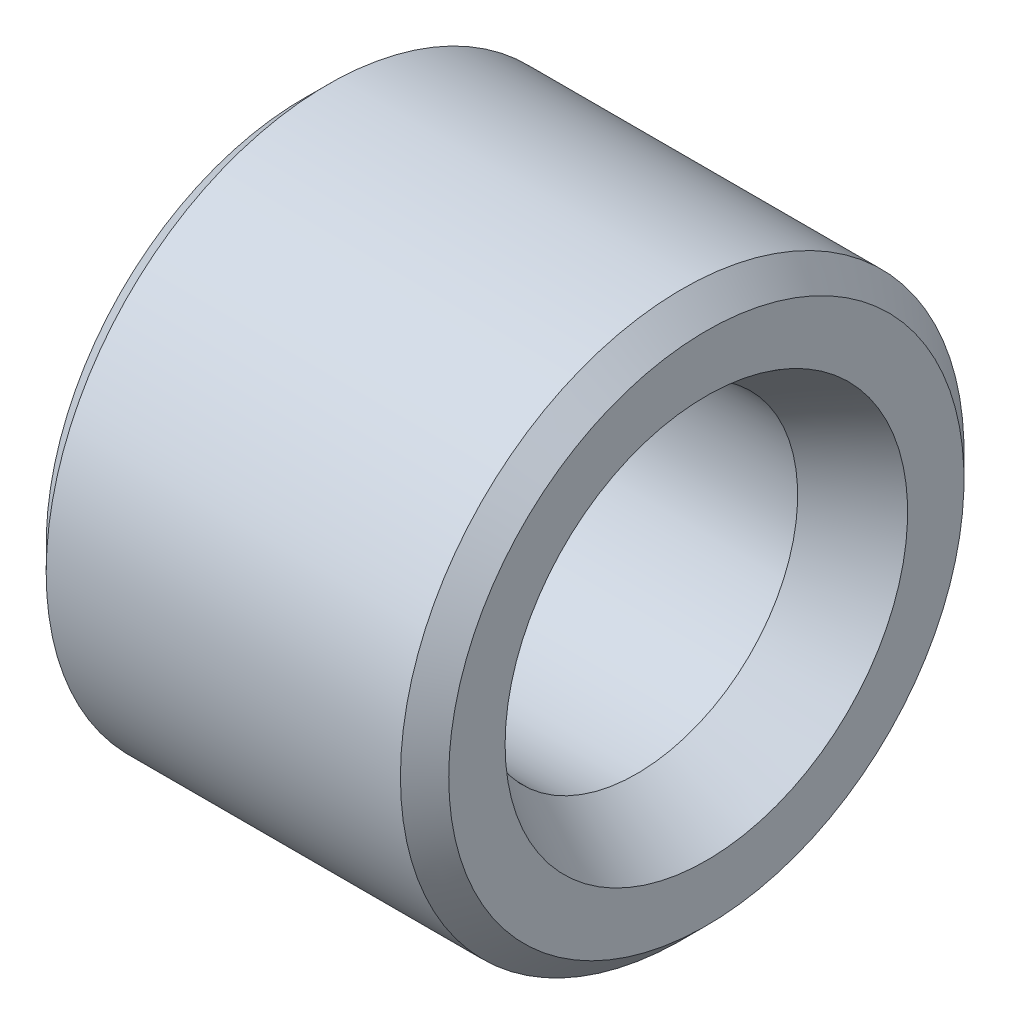
ISO-10303-21;
HEADER;
FILE_DESCRIPTION(('STEP AP214'),'2;1');
FILE_NAME('part.step','',(''),(''),'','','');
FILE_SCHEMA(('AUTOMOTIVE_DESIGN { 1 0 10303 214 1 1 1 1 }'));
ENDSEC;
DATA;
#1=APPLICATION_CONTEXT('core data for automotive mechanical design processes');
#2=APPLICATION_PROTOCOL_DEFINITION('international standard','automotive_design',2000,#1);
#3=PRODUCT_CONTEXT('',#1,'mechanical');
#4=PRODUCT('Part','Part','',(#3));
#5=PRODUCT_RELATED_PRODUCT_CATEGORY('part','',(#4));
#6=PRODUCT_DEFINITION_FORMATION('','',#4);
#7=PRODUCT_DEFINITION_CONTEXT('part definition',#1,'design');
#8=PRODUCT_DEFINITION('design','',#6,#7);
#9=PRODUCT_DEFINITION_SHAPE('','',#8);
#10=(LENGTH_UNIT() NAMED_UNIT(*) SI_UNIT(.MILLI.,.METRE.));
#11=(NAMED_UNIT(*) PLANE_ANGLE_UNIT() SI_UNIT($,.RADIAN.));
#12=(NAMED_UNIT(*) SI_UNIT($,.STERADIAN.) SOLID_ANGLE_UNIT());
#13=UNCERTAINTY_MEASURE_WITH_UNIT(LENGTH_MEASURE(1.E-05),#10,'distance_accuracy_value','');
#14=(GEOMETRIC_REPRESENTATION_CONTEXT(3) GLOBAL_UNCERTAINTY_ASSIGNED_CONTEXT((#13)) GLOBAL_UNIT_ASSIGNED_CONTEXT((#10,
#11,#12)) REPRESENTATION_CONTEXT('',''));
#15=CARTESIAN_POINT('',(0.,0.,0.));
#16=DIRECTION('',(0.,0.,1.));
#17=DIRECTION('',(1.,0.,0.));
#18=AXIS2_PLACEMENT_3D('',#15,#16,#17);
#19=CARTESIAN_POINT('',(0.,0.,0.));
#20=DIRECTION('',(-1.,0.,0.));
#21=DIRECTION('',(0.,0.,1.));
#22=AXIS2_PLACEMENT_3D('',#19,#20,#21);
#23=CYLINDRICAL_SURFACE('',#22,2.);
#24=CARTESIAN_POINT('',(0.866025403784451,0.,0.));
#25=DIRECTION('',(-1.,0.,0.));
#26=DIRECTION('',(0.,0.,1.));
#27=AXIS2_PLACEMENT_3D('',#24,#25,#26);
#28=CIRCLE('',#27,2.);
#29=CARTESIAN_POINT('',(0.866025403784451,0.,2.));
#30=VERTEX_POINT('',#29);
#31=EDGE_CURVE('E72',#30,#30,#28,.T.);
#32=ORIENTED_EDGE('',*,*,#31,.T.);
#33=EDGE_LOOP('',(#32));
#34=FACE_BOUND('',#33,.T.);
#35=CARTESIAN_POINT('',(4.13397459621555,0.,0.));
#36=DIRECTION('',(-1.,0.,0.));
#37=DIRECTION('',(0.,0.,1.));
#38=AXIS2_PLACEMENT_3D('',#35,#36,#37);
#39=CIRCLE('',#38,2.);
#40=CARTESIAN_POINT('',(4.13397459621555,0.,2.));
#41=VERTEX_POINT('',#40);
#42=EDGE_CURVE('E80',#41,#41,#39,.T.);
#43=ORIENTED_EDGE('',*,*,#42,.F.);
#44=EDGE_LOOP('',(#43));
#45=FACE_BOUND('',#44,.T.);
#46=ADVANCED_FACE('F42',(#34,#45),#23,.F.);
#47=CARTESIAN_POINT('',(5.,3.5,0.));
#48=DIRECTION('',(-1.,0.,0.));
#49=DIRECTION('',(0.,0.,1.));
#50=AXIS2_PLACEMENT_3D('',#47,#48,#49);
#51=PLANE('',#50);
#52=CARTESIAN_POINT('',(5.,0.,0.));
#53=DIRECTION('',(-1.,0.,0.));
#54=DIRECTION('',(0.,0.,1.));
#55=AXIS2_PLACEMENT_3D('',#52,#53,#54);
#56=CIRCLE('',#55,3.2);
#57=CARTESIAN_POINT('',(5.,0.,3.2));
#58=VERTEX_POINT('',#57);
#59=EDGE_CURVE('E50',#58,#58,#56,.F.);
#60=ORIENTED_EDGE('',*,*,#59,.T.);
#61=EDGE_LOOP('',(#60));
#62=FACE_BOUND('',#61,.T.);
#63=CARTESIAN_POINT('',(5.,0.,0.));
#64=DIRECTION('',(-1.,0.,0.));
#65=DIRECTION('',(0.,0.,1.));
#66=AXIS2_PLACEMENT_3D('',#63,#64,#65);
#67=CIRCLE('',#66,2.5);
#68=CARTESIAN_POINT('',(5.,0.,2.5));
#69=VERTEX_POINT('',#68);
#70=EDGE_CURVE('E76',#69,#69,#67,.T.);
#71=ORIENTED_EDGE('',*,*,#70,.T.);
#72=EDGE_LOOP('',(#71));
#73=FACE_BOUND('',#72,.T.);
#74=ADVANCED_FACE('F90',(#62,#73),#51,.F.);
#75=CARTESIAN_POINT('',(0.,2.,0.));
#76=DIRECTION('',(1.,0.,0.));
#77=DIRECTION('',(0.,0.,-1.));
#78=AXIS2_PLACEMENT_3D('',#75,#76,#77);
#79=PLANE('',#78);
#80=CARTESIAN_POINT('',(0.,0.,0.));
#81=DIRECTION('',(1.,0.,0.));
#82=DIRECTION('',(0.,0.,-1.));
#83=AXIS2_PLACEMENT_3D('',#80,#81,#82);
#84=CIRCLE('',#83,3.2);
#85=CARTESIAN_POINT('',(0.,0.,-3.2));
#86=VERTEX_POINT('',#85);
#87=EDGE_CURVE('E10',#86,#86,#84,.F.);
#88=ORIENTED_EDGE('',*,*,#87,.T.);
#89=EDGE_LOOP('',(#88));
#90=FACE_BOUND('',#89,.T.);
#91=CARTESIAN_POINT('',(0.,0.,0.));
#92=DIRECTION('',(-1.,0.,0.));
#93=DIRECTION('',(0.,0.,1.));
#94=AXIS2_PLACEMENT_3D('',#91,#92,#93);
#95=CIRCLE('',#94,2.5);
#96=CARTESIAN_POINT('',(0.,0.,2.5));
#97=VERTEX_POINT('',#96);
#98=EDGE_CURVE('E68',#97,#97,#95,.T.);
#99=ORIENTED_EDGE('',*,*,#98,.F.);
#100=EDGE_LOOP('',(#99));
#101=FACE_BOUND('',#100,.T.);
#102=ADVANCED_FACE('F96',(#90,#101),#79,.F.);
#103=CARTESIAN_POINT('',(0.,0.,0.));
#104=DIRECTION('',(-1.,0.,0.));
#105=DIRECTION('',(0.,0.,1.));
#106=AXIS2_PLACEMENT_3D('',#103,#104,#105);
#107=CYLINDRICAL_SURFACE('',#106,3.5);
#108=CARTESIAN_POINT('',(4.7,0.,0.));
#109=DIRECTION('',(-1.,0.,0.));
#110=DIRECTION('',(0.,0.,1.));
#111=AXIS2_PLACEMENT_3D('',#108,#109,#110);
#112=CIRCLE('',#111,3.5);
#113=CARTESIAN_POINT('',(4.7,0.,3.5));
#114=VERTEX_POINT('',#113);
#115=EDGE_CURVE('E56',#114,#114,#112,.T.);
#116=CARTESIAN_POINT('',(0.300000000000001,0.,0.));
#117=DIRECTION('',(1.,0.,0.));
#118=DIRECTION('',(0.,0.,-1.));
#119=AXIS2_PLACEMENT_3D('',#116,#117,#118);
#120=CIRCLE('',#119,3.5);
#121=CARTESIAN_POINT('',(0.300000000000001,0.,3.5));
#122=VERTEX_POINT('',#121);
#123=EDGE_CURVE('E62',#122,#122,#120,.T.);
#124=CARTESIAN_POINT('',(4.7,0.,3.5));
#125=CARTESIAN_POINT('',(4.65416666666667,0.,3.5));
#126=CARTESIAN_POINT('',(4.60833333333334,0.,3.5));
#127=CARTESIAN_POINT('',(4.51666666666667,0.,3.5));
#128=CARTESIAN_POINT('',(4.47083333333333,0.,3.5));
#129=CARTESIAN_POINT('',(4.37916666666667,0.,3.5));
#130=CARTESIAN_POINT('',(4.33333333333333,0.,3.5));
#131=CARTESIAN_POINT('',(4.24166666666667,0.,3.5));
#132=CARTESIAN_POINT('',(4.19583333333333,0.,3.5));
#133=CARTESIAN_POINT('',(4.10416666666667,0.,3.5));
#134=CARTESIAN_POINT('',(4.05833333333333,0.,3.5));
#135=CARTESIAN_POINT('',(3.96666666666667,0.,3.5));
#136=CARTESIAN_POINT('',(3.92083333333333,0.,3.5));
#137=CARTESIAN_POINT('',(3.82916666666667,0.,3.5));
#138=CARTESIAN_POINT('',(3.78333333333333,0.,3.5));
#139=CARTESIAN_POINT('',(3.69166666666667,0.,3.5));
#140=CARTESIAN_POINT('',(3.64583333333333,0.,3.5));
#141=CARTESIAN_POINT('',(3.55416666666667,0.,3.5));
#142=CARTESIAN_POINT('',(3.50833333333333,0.,3.5));
#143=CARTESIAN_POINT('',(3.41666666666667,0.,3.5));
#144=CARTESIAN_POINT('',(3.37083333333333,0.,3.5));
#145=CARTESIAN_POINT('',(3.27916666666667,0.,3.5));
#146=CARTESIAN_POINT('',(3.23333333333333,0.,3.5));
#147=CARTESIAN_POINT('',(3.14166666666667,0.,3.5));
#148=CARTESIAN_POINT('',(3.09583333333333,0.,3.5));
#149=CARTESIAN_POINT('',(3.00416666666667,0.,3.5));
#150=CARTESIAN_POINT('',(2.95833333333333,0.,3.5));
#151=CARTESIAN_POINT('',(2.86666666666667,0.,3.5));
#152=CARTESIAN_POINT('',(2.82083333333333,0.,3.5));
#153=CARTESIAN_POINT('',(2.72916666666667,0.,3.5));
#154=CARTESIAN_POINT('',(2.68333333333333,0.,3.5));
#155=CARTESIAN_POINT('',(2.59166666666667,0.,3.5));
#156=CARTESIAN_POINT('',(2.54583333333333,0.,3.5));
#157=CARTESIAN_POINT('',(2.45416666666667,0.,3.5));
#158=CARTESIAN_POINT('',(2.40833333333333,0.,3.5));
#159=CARTESIAN_POINT('',(2.31666666666667,0.,3.5));
#160=CARTESIAN_POINT('',(2.27083333333333,0.,3.5));
#161=CARTESIAN_POINT('',(2.17916666666667,0.,3.5));
#162=CARTESIAN_POINT('',(2.13333333333333,0.,3.5));
#163=CARTESIAN_POINT('',(2.04166666666667,0.,3.5));
#164=CARTESIAN_POINT('',(1.99583333333333,0.,3.5));
#165=CARTESIAN_POINT('',(1.90416666666667,0.,3.5));
#166=CARTESIAN_POINT('',(1.85833333333333,0.,3.5));
#167=CARTESIAN_POINT('',(1.76666666666667,0.,3.5));
#168=CARTESIAN_POINT('',(1.72083333333333,0.,3.5));
#169=CARTESIAN_POINT('',(1.62916666666667,0.,3.5));
#170=CARTESIAN_POINT('',(1.58333333333333,0.,3.5));
#171=CARTESIAN_POINT('',(1.49166666666667,0.,3.5));
#172=CARTESIAN_POINT('',(1.44583333333333,0.,3.5));
#173=CARTESIAN_POINT('',(1.35416666666667,0.,3.5));
#174=CARTESIAN_POINT('',(1.30833333333333,0.,3.5));
#175=CARTESIAN_POINT('',(1.21666666666667,0.,3.5));
#176=CARTESIAN_POINT('',(1.17083333333333,0.,3.5));
#177=CARTESIAN_POINT('',(1.07916666666667,0.,3.5));
#178=CARTESIAN_POINT('',(1.03333333333333,0.,3.5));
#179=CARTESIAN_POINT('',(0.941666666666668,0.,3.5));
#180=CARTESIAN_POINT('',(0.895833333333334,0.,3.5));
#181=CARTESIAN_POINT('',(0.804166666666667,0.,3.5));
#182=CARTESIAN_POINT('',(0.758333333333334,0.,3.5));
#183=CARTESIAN_POINT('',(0.666666666666667,0.,3.5));
#184=CARTESIAN_POINT('',(0.620833333333334,0.,3.5));
#185=CARTESIAN_POINT('',(0.529166666666667,0.,3.5));
#186=CARTESIAN_POINT('',(0.483333333333334,0.,3.5));
#187=CARTESIAN_POINT('',(0.391666666666667,0.,3.5));
#188=CARTESIAN_POINT('',(0.345833333333334,0.,3.5));
#189=CARTESIAN_POINT('',(0.300000000000001,0.,3.5));
#190=B_SPLINE_CURVE_WITH_KNOTS('',3,(#124,#125,#126,#127,#128,#129,#130,#131,#132,#133,#134,
#135,#136,#137,#138,#139,#140,#141,#142,#143,#144,#145,#146,#147,#148,#149,#150,#151,#152,#153,
#154,#155,#156,#157,#158,#159,#160,#161,#162,#163,#164,#165,#166,#167,#168,#169,#170,#171,#172,
#173,#174,#175,#176,#177,#178,#179,#180,#181,#182,#183,#184,#185,#186,#187,#188,#189),
.UNSPECIFIED.,.F.,.F.,(4,2,2,2,2,2,2,2,2,2,2,2,2,2,2,2,2,2,2,2,2,2,2,2,2,2,2,2,2,2,2,2,4),(0.,
0.1375,0.275,0.4125,0.55,0.6875,0.825,0.9625,1.1,1.2375,1.375,1.5125,1.65,1.7875,1.925,2.0625,
2.2,2.3375,2.475,2.6125,2.75,2.8875,3.025,3.1625,3.3,3.4375,3.575,3.7125,3.85,3.9875,4.125,
4.2625,4.4),.UNSPECIFIED.);
#191=EDGE_CURVE('BSEAM102',#114,#122,#190,.T.);
#192=ORIENTED_EDGE('',*,*,#115,.T.);
#193=ORIENTED_EDGE('',*,*,#123,.T.);
#194=ORIENTED_EDGE('',*,*,#191,.T.);
#195=ORIENTED_EDGE('',*,*,#191,.F.);
#196=EDGE_LOOP('',(#192,#194,#193,#195));
#197=FACE_BOUND('',#196,.T.);
#198=ADVANCED_FACE('F102',(#197),#107,.T.);
#199=CARTESIAN_POINT('',(4.7,0.,0.));
#200=DIRECTION('',(-1.,0.,0.));
#201=DIRECTION('',(0.,0.,1.));
#202=AXIS2_PLACEMENT_3D('',#199,#200,#201);
#203=CONICAL_SURFACE('',#202,3.5,0.785398163397448);
#204=CARTESIAN_POINT('',(5.,0.,3.2));
#205=CARTESIAN_POINT('',(4.996875,0.,3.203125));
#206=CARTESIAN_POINT('',(4.99375,0.,3.20625));
#207=CARTESIAN_POINT('',(4.9875,0.,3.2125));
#208=CARTESIAN_POINT('',(4.984375,0.,3.215625));
#209=CARTESIAN_POINT('',(4.978125,0.,3.221875));
#210=CARTESIAN_POINT('',(4.975,0.,3.225));
#211=CARTESIAN_POINT('',(4.96875,0.,3.23125));
#212=CARTESIAN_POINT('',(4.965625,0.,3.234375));
#213=CARTESIAN_POINT('',(4.959375,0.,3.240625));
#214=CARTESIAN_POINT('',(4.95625,0.,3.24375));
#215=CARTESIAN_POINT('',(4.95,0.,3.25));
#216=CARTESIAN_POINT('',(4.946875,0.,3.253125));
#217=CARTESIAN_POINT('',(4.940625,0.,3.259375));
#218=CARTESIAN_POINT('',(4.9375,0.,3.2625));
#219=CARTESIAN_POINT('',(4.93125,0.,3.26875));
#220=CARTESIAN_POINT('',(4.928125,0.,3.271875));
#221=CARTESIAN_POINT('',(4.921875,0.,3.278125));
#222=CARTESIAN_POINT('',(4.91875,0.,3.28125));
#223=CARTESIAN_POINT('',(4.9125,0.,3.2875));
#224=CARTESIAN_POINT('',(4.909375,0.,3.290625));
#225=CARTESIAN_POINT('',(4.903125,0.,3.296875));
#226=CARTESIAN_POINT('',(4.9,0.,3.3));
#227=CARTESIAN_POINT('',(4.89375,0.,3.30625));
#228=CARTESIAN_POINT('',(4.890625,0.,3.309375));
#229=CARTESIAN_POINT('',(4.884375,0.,3.315625));
#230=CARTESIAN_POINT('',(4.88125,0.,3.31875));
#231=CARTESIAN_POINT('',(4.875,0.,3.325));
#232=CARTESIAN_POINT('',(4.871875,0.,3.328125));
#233=CARTESIAN_POINT('',(4.865625,0.,3.334375));
#234=CARTESIAN_POINT('',(4.8625,0.,3.3375));
#235=CARTESIAN_POINT('',(4.85625,0.,3.34375));
#236=CARTESIAN_POINT('',(4.853125,0.,3.346875));
#237=CARTESIAN_POINT('',(4.846875,0.,3.353125));
#238=CARTESIAN_POINT('',(4.84375,0.,3.35625));
#239=CARTESIAN_POINT('',(4.8375,0.,3.3625));
#240=CARTESIAN_POINT('',(4.834375,0.,3.365625));
#241=CARTESIAN_POINT('',(4.828125,0.,3.371875));
#242=CARTESIAN_POINT('',(4.825,0.,3.375));
#243=CARTESIAN_POINT('',(4.81875,0.,3.38125));
#244=CARTESIAN_POINT('',(4.815625,0.,3.384375));
#245=CARTESIAN_POINT('',(4.809375,0.,3.390625));
#246=CARTESIAN_POINT('',(4.80625,0.,3.39375));
#247=CARTESIAN_POINT('',(4.8,0.,3.4));
#248=CARTESIAN_POINT('',(4.796875,0.,3.403125));
#249=CARTESIAN_POINT('',(4.790625,0.,3.409375));
#250=CARTESIAN_POINT('',(4.7875,0.,3.4125));
#251=CARTESIAN_POINT('',(4.78125,0.,3.41875));
#252=CARTESIAN_POINT('',(4.778125,0.,3.421875));
#253=CARTESIAN_POINT('',(4.771875,0.,3.428125));
#254=CARTESIAN_POINT('',(4.76875,0.,3.43125));
#255=CARTESIAN_POINT('',(4.7625,0.,3.4375));
#256=CARTESIAN_POINT('',(4.759375,0.,3.440625));
#257=CARTESIAN_POINT('',(4.753125,0.,3.446875));
#258=CARTESIAN_POINT('',(4.75,0.,3.45));
#259=CARTESIAN_POINT('',(4.74375,0.,3.45625));
#260=CARTESIAN_POINT('',(4.740625,0.,3.459375));
#261=CARTESIAN_POINT('',(4.734375,0.,3.465625));
#262=CARTESIAN_POINT('',(4.73125,0.,3.46875));
#263=CARTESIAN_POINT('',(4.725,0.,3.475));
#264=CARTESIAN_POINT('',(4.721875,0.,3.478125));
#265=CARTESIAN_POINT('',(4.715625,0.,3.484375));
#266=CARTESIAN_POINT('',(4.7125,0.,3.4875));
#267=CARTESIAN_POINT('',(4.70625,0.,3.49375));
#268=CARTESIAN_POINT('',(4.703125,0.,3.496875));
#269=CARTESIAN_POINT('',(4.7,0.,3.5));
#270=B_SPLINE_CURVE_WITH_KNOTS('',3,(#204,#205,#206,#207,#208,#209,#210,#211,#212,#213,#214,
#215,#216,#217,#218,#219,#220,#221,#222,#223,#224,#225,#226,#227,#228,#229,#230,#231,#232,#233,
#234,#235,#236,#237,#238,#239,#240,#241,#242,#243,#244,#245,#246,#247,#248,#249,#250,#251,#252,
#253,#254,#255,#256,#257,#258,#259,#260,#261,#262,#263,#264,#265,#266,#267,#268,#269),
.UNSPECIFIED.,.F.,.F.,(4,2,2,2,2,2,2,2,2,2,2,2,2,2,2,2,2,2,2,2,2,2,2,2,2,2,2,2,2,2,2,2,4),(0.,
0.0132582521472481,0.026516504294496,0.0397747564417435,0.053033008588991,0.0662912607362395,
0.079549512883487,0.0928077650307349,0.106066017177982,0.11932426932523,0.132582521472478,
0.145840773619726,0.159099025766974,0.172357277914221,0.18561553006147,0.198873782208717,
0.212132034355965,0.225390286503213,0.23864853865046,0.251906790797709,0.265165042944956,
0.278423295092204,0.291681547239452,0.3049397993867,0.318198051533948,0.331456303681195,
0.344714555828443,0.35797280797569,0.371231060122939,0.384489312270186,0.397747564417434,
0.411005816564682,0.42426406871193),.UNSPECIFIED.);
#271=EDGE_CURVE('BSEAM100',#58,#114,#270,.T.);
#272=ORIENTED_EDGE('',*,*,#59,.F.);
#273=ORIENTED_EDGE('',*,*,#115,.F.);
#274=ORIENTED_EDGE('',*,*,#271,.T.);
#275=ORIENTED_EDGE('',*,*,#271,.F.);
#276=EDGE_LOOP('',(#272,#274,#273,#275));
#277=FACE_BOUND('',#276,.T.);
#278=ADVANCED_FACE('F100',(#277),#203,.T.);
#279=CARTESIAN_POINT('',(0.,0.,0.));
#280=DIRECTION('',(1.,0.,0.));
#281=DIRECTION('',(0.,0.,-1.));
#282=AXIS2_PLACEMENT_3D('',#279,#280,#281);
#283=CONICAL_SURFACE('',#282,3.2,0.785398163397448);
#284=ORIENTED_EDGE('',*,*,#123,.F.);
#285=EDGE_LOOP('',(#284));
#286=FACE_BOUND('',#285,.T.);
#287=ORIENTED_EDGE('',*,*,#87,.F.);
#288=EDGE_LOOP('',(#287));
#289=FACE_BOUND('',#288,.T.);
#290=ADVANCED_FACE('F44',(#286,#289),#283,.T.);
#291=CARTESIAN_POINT('',(0.866025403784451,0.,0.));
#292=DIRECTION('',(-1.,0.,0.));
#293=DIRECTION('',(0.,0.,1.));
#294=AXIS2_PLACEMENT_3D('',#291,#292,#293);
#295=CONICAL_SURFACE('',#294,2.,0.523598775598293);
#296=ORIENTED_EDGE('',*,*,#98,.T.);
#297=EDGE_LOOP('',(#296));
#298=FACE_BOUND('',#297,.T.);
#299=ORIENTED_EDGE('',*,*,#31,.F.);
#300=EDGE_LOOP('',(#299));
#301=FACE_BOUND('',#300,.T.);
#302=ADVANCED_FACE('F108',(#298,#301),#295,.F.);
#303=CARTESIAN_POINT('',(5.,0.,0.));
#304=DIRECTION('',(1.,0.,0.));
#305=DIRECTION('',(0.,0.,-1.));
#306=AXIS2_PLACEMENT_3D('',#303,#304,#305);
#307=CONICAL_SURFACE('',#306,2.5,0.523598775598293);
#308=ORIENTED_EDGE('',*,*,#42,.T.);
#309=EDGE_LOOP('',(#308));
#310=FACE_BOUND('',#309,.T.);
#311=ORIENTED_EDGE('',*,*,#70,.F.);
#312=EDGE_LOOP('',(#311));
#313=FACE_BOUND('',#312,.T.);
#314=ADVANCED_FACE('F86',(#310,#313),#307,.F.);
#315=CLOSED_SHELL('',(#46,#74,#102,#198,#278,#290,#302,#314));
#316=MANIFOLD_SOLID_BREP('B2',#315);
#317=ADVANCED_BREP_SHAPE_REPRESENTATION('',(#18,#316),#14);
#318=SHAPE_DEFINITION_REPRESENTATION(#9,#317);
ENDSEC;
END-ISO-10303-21;
